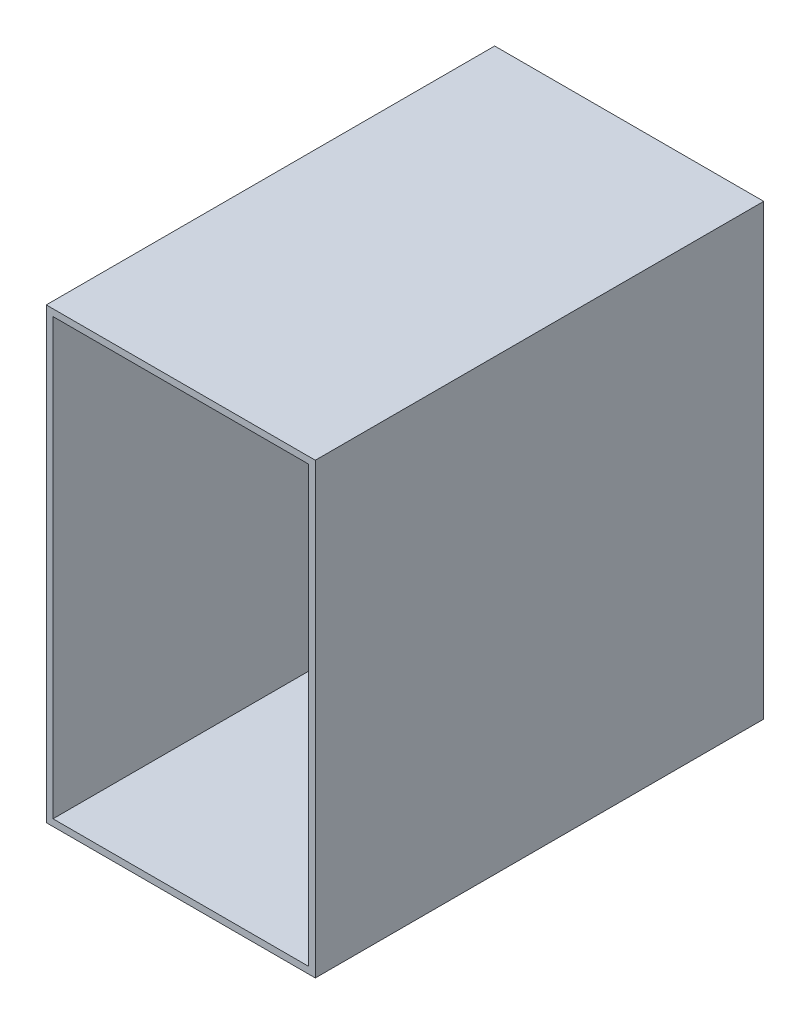
ISO-10303-21;
HEADER;
FILE_DESCRIPTION(('STEP AP214'),'2;1');
FILE_NAME('part.step','',(''),(''),'','','');
FILE_SCHEMA(('AUTOMOTIVE_DESIGN { 1 0 10303 214 1 1 1 1 }'));
ENDSEC;
DATA;
#1=APPLICATION_CONTEXT('core data for automotive mechanical design processes');
#2=APPLICATION_PROTOCOL_DEFINITION('international standard','automotive_design',2000,#1);
#3=PRODUCT_CONTEXT('',#1,'mechanical');
#4=PRODUCT('Part','Part','',(#3));
#5=PRODUCT_RELATED_PRODUCT_CATEGORY('part','',(#4));
#6=PRODUCT_DEFINITION_FORMATION('','',#4);
#7=PRODUCT_DEFINITION_CONTEXT('part definition',#1,'design');
#8=PRODUCT_DEFINITION('design','',#6,#7);
#9=PRODUCT_DEFINITION_SHAPE('','',#8);
#10=(LENGTH_UNIT() NAMED_UNIT(*) SI_UNIT(.MILLI.,.METRE.));
#11=(NAMED_UNIT(*) PLANE_ANGLE_UNIT() SI_UNIT($,.RADIAN.));
#12=(NAMED_UNIT(*) SI_UNIT($,.STERADIAN.) SOLID_ANGLE_UNIT());
#13=UNCERTAINTY_MEASURE_WITH_UNIT(LENGTH_MEASURE(1.E-05),#10,'distance_accuracy_value','');
#14=(GEOMETRIC_REPRESENTATION_CONTEXT(3) GLOBAL_UNCERTAINTY_ASSIGNED_CONTEXT((#13)) GLOBAL_UNIT_ASSIGNED_CONTEXT((#10,
#11,#12)) REPRESENTATION_CONTEXT('',''));
#15=CARTESIAN_POINT('',(0.,0.,0.));
#16=DIRECTION('',(0.,0.,1.));
#17=DIRECTION('',(1.,0.,0.));
#18=AXIS2_PLACEMENT_3D('',#15,#16,#17);
#19=CARTESIAN_POINT('',(0.,0.,200.));
#20=DIRECTION('',(0.,0.,-1.));
#21=DIRECTION('',(-1.,0.,0.));
#22=AXIS2_PLACEMENT_3D('',#19,#20,#21);
#23=PLANE('',#22);
#24=DIRECTION('',(0.,-1.,0.));
#25=VECTOR('',#24,1.);
#26=CARTESIAN_POINT('',(0.,0.,200.));
#27=LINE('',#26,#25);
#28=CARTESIAN_POINT('',(0.,200.,200.));
#29=VERTEX_POINT('',#28);
#30=CARTESIAN_POINT('',(0.,0.,200.));
#31=VERTEX_POINT('',#30);
#32=EDGE_CURVE('E149',#29,#31,#27,.T.);
#33=ORIENTED_EDGE('',*,*,#32,.T.);
#34=DIRECTION('',(1.,0.,0.));
#35=VECTOR('',#34,1.);
#36=CARTESIAN_POINT('',(0.,0.,200.));
#37=LINE('',#36,#35);
#38=CARTESIAN_POINT('',(120.,0.,200.));
#39=VERTEX_POINT('',#38);
#40=EDGE_CURVE('E93',#31,#39,#37,.T.);
#41=ORIENTED_EDGE('',*,*,#40,.T.);
#42=DIRECTION('',(0.,1.,0.));
#43=VECTOR('',#42,1.);
#44=CARTESIAN_POINT('',(120.,0.,200.));
#45=LINE('',#44,#43);
#46=CARTESIAN_POINT('',(120.,200.,200.));
#47=VERTEX_POINT('',#46);
#48=EDGE_CURVE('E152',#39,#47,#45,.T.);
#49=ORIENTED_EDGE('',*,*,#48,.T.);
#50=DIRECTION('',(-1.,0.,0.));
#51=VECTOR('',#50,1.);
#52=CARTESIAN_POINT('',(0.,200.,200.));
#53=LINE('',#52,#51);
#54=EDGE_CURVE('E65',#47,#29,#53,.T.);
#55=ORIENTED_EDGE('',*,*,#54,.T.);
#56=EDGE_LOOP('',(#33,#41,#49,#55));
#57=FACE_BOUND('',#56,.T.);
#58=DIRECTION('',(0.,-1.,0.));
#59=VECTOR('',#58,1.);
#60=CARTESIAN_POINT('',(3.,0.,200.));
#61=LINE('',#60,#59);
#62=CARTESIAN_POINT('',(3.,197.,200.));
#63=VERTEX_POINT('',#62);
#64=CARTESIAN_POINT('',(3.,3.,200.));
#65=VERTEX_POINT('',#64);
#66=EDGE_CURVE('E138',#63,#65,#61,.T.);
#67=ORIENTED_EDGE('',*,*,#66,.F.);
#68=DIRECTION('',(-1.,0.,0.));
#69=VECTOR('',#68,1.);
#70=CARTESIAN_POINT('',(0.,197.,200.));
#71=LINE('',#70,#69);
#72=CARTESIAN_POINT('',(117.,197.,200.));
#73=VERTEX_POINT('',#72);
#74=EDGE_CURVE('E147',#73,#63,#71,.T.);
#75=ORIENTED_EDGE('',*,*,#74,.F.);
#76=DIRECTION('',(0.,1.,0.));
#77=VECTOR('',#76,1.);
#78=CARTESIAN_POINT('',(117.,0.,200.));
#79=LINE('',#78,#77);
#80=CARTESIAN_POINT('',(117.,3.,200.));
#81=VERTEX_POINT('',#80);
#82=EDGE_CURVE('E145',#81,#73,#79,.T.);
#83=ORIENTED_EDGE('',*,*,#82,.F.);
#84=DIRECTION('',(1.,0.,0.));
#85=VECTOR('',#84,1.);
#86=CARTESIAN_POINT('',(0.,3.,200.));
#87=LINE('',#86,#85);
#88=EDGE_CURVE('E130',#65,#81,#87,.T.);
#89=ORIENTED_EDGE('',*,*,#88,.F.);
#90=EDGE_LOOP('',(#67,#75,#83,#89));
#91=FACE_BOUND('',#90,.T.);
#92=ADVANCED_FACE('F41',(#57,#91),#23,.F.);
#93=CARTESIAN_POINT('',(0.,0.,200.));
#94=DIRECTION('',(1.,0.,0.));
#95=DIRECTION('',(0.,0.,-1.));
#96=AXIS2_PLACEMENT_3D('',#93,#94,#95);
#97=PLANE('',#96);
#98=DIRECTION('',(0.,-1.,0.));
#99=VECTOR('',#98,1.);
#100=CARTESIAN_POINT('',(0.,0.,0.));
#101=LINE('',#100,#99);
#102=CARTESIAN_POINT('',(0.,200.,0.));
#103=VERTEX_POINT('',#102);
#104=CARTESIAN_POINT('',(0.,0.,0.));
#105=VERTEX_POINT('',#104);
#106=EDGE_CURVE('E156',#103,#105,#101,.T.);
#107=ORIENTED_EDGE('',*,*,#106,.T.);
#108=DIRECTION('',(0.,0.,-1.));
#109=VECTOR('',#108,1.);
#110=CARTESIAN_POINT('',(0.,0.,200.));
#111=LINE('',#110,#109);
#112=EDGE_CURVE('E11',#31,#105,#111,.T.);
#113=ORIENTED_EDGE('',*,*,#112,.F.);
#114=ORIENTED_EDGE('',*,*,#32,.F.);
#115=DIRECTION('',(0.,0.,-1.));
#116=VECTOR('',#115,1.);
#117=CARTESIAN_POINT('',(0.,200.,200.));
#118=LINE('',#117,#116);
#119=EDGE_CURVE('E155',#29,#103,#118,.T.);
#120=ORIENTED_EDGE('',*,*,#119,.T.);
#121=EDGE_LOOP('',(#107,#113,#114,#120));
#122=FACE_BOUND('',#121,.T.);
#123=ADVANCED_FACE('F43',(#122),#97,.F.);
#124=CARTESIAN_POINT('',(0.,0.,200.));
#125=DIRECTION('',(0.,1.,0.));
#126=DIRECTION('',(0.,0.,1.));
#127=AXIS2_PLACEMENT_3D('',#124,#125,#126);
#128=PLANE('',#127);
#129=DIRECTION('',(1.,0.,0.));
#130=VECTOR('',#129,1.);
#131=CARTESIAN_POINT('',(0.,0.,0.));
#132=LINE('',#131,#130);
#133=CARTESIAN_POINT('',(120.,0.,0.));
#134=VERTEX_POINT('',#133);
#135=EDGE_CURVE('E159',#105,#134,#132,.T.);
#136=ORIENTED_EDGE('',*,*,#135,.T.);
#137=DIRECTION('',(0.,0.,-1.));
#138=VECTOR('',#137,1.);
#139=CARTESIAN_POINT('',(120.,0.,200.));
#140=LINE('',#139,#138);
#141=EDGE_CURVE('E49',#39,#134,#140,.T.);
#142=ORIENTED_EDGE('',*,*,#141,.F.);
#143=ORIENTED_EDGE('',*,*,#40,.F.);
#144=ORIENTED_EDGE('',*,*,#112,.T.);
#145=EDGE_LOOP('',(#136,#142,#143,#144));
#146=FACE_BOUND('',#145,.T.);
#147=ADVANCED_FACE('F187',(#146),#128,.F.);
#148=CARTESIAN_POINT('',(120.,0.,200.));
#149=DIRECTION('',(-1.,0.,0.));
#150=DIRECTION('',(0.,0.,1.));
#151=AXIS2_PLACEMENT_3D('',#148,#149,#150);
#152=PLANE('',#151);
#153=DIRECTION('',(0.,1.,0.));
#154=VECTOR('',#153,1.);
#155=CARTESIAN_POINT('',(120.,0.,0.));
#156=LINE('',#155,#154);
#157=CARTESIAN_POINT('',(120.,200.,0.));
#158=VERTEX_POINT('',#157);
#159=EDGE_CURVE('E161',#134,#158,#156,.T.);
#160=ORIENTED_EDGE('',*,*,#159,.T.);
#161=DIRECTION('',(0.,0.,-1.));
#162=VECTOR('',#161,1.);
#163=CARTESIAN_POINT('',(120.,200.,200.));
#164=LINE('',#163,#162);
#165=EDGE_CURVE('E165',#47,#158,#164,.T.);
#166=ORIENTED_EDGE('',*,*,#165,.F.);
#167=ORIENTED_EDGE('',*,*,#48,.F.);
#168=ORIENTED_EDGE('',*,*,#141,.T.);
#169=EDGE_LOOP('',(#160,#166,#167,#168));
#170=FACE_BOUND('',#169,.T.);
#171=ADVANCED_FACE('F170',(#170),#152,.F.);
#172=CARTESIAN_POINT('',(0.,200.,200.));
#173=DIRECTION('',(0.,-1.,0.));
#174=DIRECTION('',(0.,0.,-1.));
#175=AXIS2_PLACEMENT_3D('',#172,#173,#174);
#176=PLANE('',#175);
#177=DIRECTION('',(-1.,0.,0.));
#178=VECTOR('',#177,1.);
#179=CARTESIAN_POINT('',(0.,200.,0.));
#180=LINE('',#179,#178);
#181=EDGE_CURVE('E86',#158,#103,#180,.T.);
#182=ORIENTED_EDGE('',*,*,#181,.T.);
#183=ORIENTED_EDGE('',*,*,#119,.F.);
#184=ORIENTED_EDGE('',*,*,#54,.F.);
#185=ORIENTED_EDGE('',*,*,#165,.T.);
#186=EDGE_LOOP('',(#182,#183,#184,#185));
#187=FACE_BOUND('',#186,.T.);
#188=ADVANCED_FACE('F178',(#187),#176,.F.);
#189=CARTESIAN_POINT('',(0.,0.,0.));
#190=DIRECTION('',(0.,0.,-1.));
#191=DIRECTION('',(-1.,0.,0.));
#192=AXIS2_PLACEMENT_3D('',#189,#190,#191);
#193=PLANE('',#192);
#194=ORIENTED_EDGE('',*,*,#106,.F.);
#195=ORIENTED_EDGE('',*,*,#181,.F.);
#196=ORIENTED_EDGE('',*,*,#159,.F.);
#197=ORIENTED_EDGE('',*,*,#135,.F.);
#198=EDGE_LOOP('',(#194,#195,#196,#197));
#199=FACE_BOUND('',#198,.T.);
#200=ADVANCED_FACE('F174',(#199),#193,.T.);
#201=CARTESIAN_POINT('',(3.,0.,200.));
#202=DIRECTION('',(1.,0.,0.));
#203=DIRECTION('',(0.,0.,-1.));
#204=AXIS2_PLACEMENT_3D('',#201,#202,#203);
#205=PLANE('',#204);
#206=DIRECTION('',(0.,-1.,0.));
#207=VECTOR('',#206,1.);
#208=CARTESIAN_POINT('',(3.,0.,3.));
#209=LINE('',#208,#207);
#210=CARTESIAN_POINT('',(3.,197.,3.));
#211=VERTEX_POINT('',#210);
#212=CARTESIAN_POINT('',(3.,3.,3.));
#213=VERTEX_POINT('',#212);
#214=EDGE_CURVE('E121',#211,#213,#209,.T.);
#215=ORIENTED_EDGE('',*,*,#214,.F.);
#216=DIRECTION('',(0.,0.,-1.));
#217=VECTOR('',#216,1.);
#218=CARTESIAN_POINT('',(3.,197.,200.));
#219=LINE('',#218,#217);
#220=EDGE_CURVE('E141',#63,#211,#219,.T.);
#221=ORIENTED_EDGE('',*,*,#220,.F.);
#222=ORIENTED_EDGE('',*,*,#66,.T.);
#223=DIRECTION('',(0.,0.,-1.));
#224=VECTOR('',#223,1.);
#225=CARTESIAN_POINT('',(3.,3.,200.));
#226=LINE('',#225,#224);
#227=EDGE_CURVE('E133',#65,#213,#226,.T.);
#228=ORIENTED_EDGE('',*,*,#227,.T.);
#229=EDGE_LOOP('',(#215,#221,#222,#228));
#230=FACE_BOUND('',#229,.T.);
#231=ADVANCED_FACE('F185',(#230),#205,.T.);
#232=CARTESIAN_POINT('',(0.,3.,200.));
#233=DIRECTION('',(0.,1.,0.));
#234=DIRECTION('',(0.,0.,1.));
#235=AXIS2_PLACEMENT_3D('',#232,#233,#234);
#236=PLANE('',#235);
#237=DIRECTION('',(1.,0.,0.));
#238=VECTOR('',#237,1.);
#239=CARTESIAN_POINT('',(0.,3.,3.));
#240=LINE('',#239,#238);
#241=CARTESIAN_POINT('',(117.,3.,3.));
#242=VERTEX_POINT('',#241);
#243=EDGE_CURVE('E115',#213,#242,#240,.T.);
#244=ORIENTED_EDGE('',*,*,#243,.F.);
#245=ORIENTED_EDGE('',*,*,#227,.F.);
#246=ORIENTED_EDGE('',*,*,#88,.T.);
#247=DIRECTION('',(0.,0.,-1.));
#248=VECTOR('',#247,1.);
#249=CARTESIAN_POINT('',(117.,3.,200.));
#250=LINE('',#249,#248);
#251=EDGE_CURVE('E127',#81,#242,#250,.T.);
#252=ORIENTED_EDGE('',*,*,#251,.T.);
#253=EDGE_LOOP('',(#244,#245,#246,#252));
#254=FACE_BOUND('',#253,.T.);
#255=ADVANCED_FACE('F128',(#254),#236,.T.);
#256=CARTESIAN_POINT('',(117.,0.,200.));
#257=DIRECTION('',(-1.,0.,0.));
#258=DIRECTION('',(0.,0.,1.));
#259=AXIS2_PLACEMENT_3D('',#256,#257,#258);
#260=PLANE('',#259);
#261=CARTESIAN_POINT('',(117.,100.,100.));
#262=DIRECTION('',(-1.,0.,0.));
#263=DIRECTION('',(0.,0.,1.));
#264=AXIS2_PLACEMENT_3D('',#261,#262,#263);
#265=CIRCLE('',#264,9.99999999999999);
#266=CARTESIAN_POINT('',(117.,100.,110.));
#267=VERTEX_POINT('',#266);
#268=EDGE_CURVE('E221',#267,#267,#265,.T.);
#269=ORIENTED_EDGE('',*,*,#268,.F.);
#270=EDGE_LOOP('',(#269));
#271=FACE_BOUND('',#270,.T.);
#272=DIRECTION('',(0.,1.,0.));
#273=VECTOR('',#272,1.);
#274=CARTESIAN_POINT('',(117.,0.,3.));
#275=LINE('',#274,#273);
#276=CARTESIAN_POINT('',(117.,197.,3.));
#277=VERTEX_POINT('',#276);
#278=EDGE_CURVE('E119',#242,#277,#275,.T.);
#279=ORIENTED_EDGE('',*,*,#278,.F.);
#280=ORIENTED_EDGE('',*,*,#251,.F.);
#281=ORIENTED_EDGE('',*,*,#82,.T.);
#282=DIRECTION('',(0.,0.,-1.));
#283=VECTOR('',#282,1.);
#284=CARTESIAN_POINT('',(117.,197.,200.));
#285=LINE('',#284,#283);
#286=EDGE_CURVE('E56',#73,#277,#285,.T.);
#287=ORIENTED_EDGE('',*,*,#286,.T.);
#288=EDGE_LOOP('',(#279,#280,#281,#287));
#289=FACE_BOUND('',#288,.T.);
#290=ADVANCED_FACE('F135',(#271,#289),#260,.T.);
#291=CARTESIAN_POINT('',(0.,197.,200.));
#292=DIRECTION('',(0.,-1.,0.));
#293=DIRECTION('',(0.,0.,-1.));
#294=AXIS2_PLACEMENT_3D('',#291,#292,#293);
#295=PLANE('',#294);
#296=DIRECTION('',(-1.,0.,0.));
#297=VECTOR('',#296,1.);
#298=CARTESIAN_POINT('',(0.,197.,3.));
#299=LINE('',#298,#297);
#300=EDGE_CURVE('E136',#277,#211,#299,.T.);
#301=ORIENTED_EDGE('',*,*,#300,.F.);
#302=ORIENTED_EDGE('',*,*,#286,.F.);
#303=ORIENTED_EDGE('',*,*,#74,.T.);
#304=ORIENTED_EDGE('',*,*,#220,.T.);
#305=EDGE_LOOP('',(#301,#302,#303,#304));
#306=FACE_BOUND('',#305,.T.);
#307=ADVANCED_FACE('F199',(#306),#295,.T.);
#308=CARTESIAN_POINT('',(0.,0.,3.));
#309=DIRECTION('',(0.,0.,-1.));
#310=DIRECTION('',(-1.,0.,0.));
#311=AXIS2_PLACEMENT_3D('',#308,#309,#310);
#312=PLANE('',#311);
#313=ORIENTED_EDGE('',*,*,#214,.T.);
#314=ORIENTED_EDGE('',*,*,#243,.T.);
#315=ORIENTED_EDGE('',*,*,#278,.T.);
#316=ORIENTED_EDGE('',*,*,#300,.T.);
#317=EDGE_LOOP('',(#313,#314,#315,#316));
#318=FACE_BOUND('',#317,.T.);
#319=ADVANCED_FACE('F117',(#318),#312,.F.);
#320=CARTESIAN_POINT('',(37.,100.,100.));
#321=DIRECTION('',(1.,0.,0.));
#322=DIRECTION('',(0.,0.,-1.));
#323=AXIS2_PLACEMENT_3D('',#320,#321,#322);
#324=CYLINDRICAL_SURFACE('',#323,9.99999999999999);
#325=CARTESIAN_POINT('',(37.,100.,100.));
#326=DIRECTION('',(-1.,0.,0.));
#327=DIRECTION('',(0.,0.,1.));
#328=AXIS2_PLACEMENT_3D('',#325,#326,#327);
#329=CIRCLE('',#328,9.99999999999999);
#330=CARTESIAN_POINT('',(37.,100.,110.));
#331=VERTEX_POINT('',#330);
#332=EDGE_CURVE('E220',#331,#331,#329,.T.);
#333=ORIENTED_EDGE('',*,*,#332,.F.);
#334=EDGE_LOOP('',(#333));
#335=FACE_BOUND('',#334,.T.);
#336=ORIENTED_EDGE('',*,*,#268,.T.);
#337=EDGE_LOOP('',(#336));
#338=FACE_BOUND('',#337,.T.);
#339=ADVANCED_FACE('F198',(#335,#338),#324,.T.);
#340=CARTESIAN_POINT('',(37.,100.,100.));
#341=DIRECTION('',(-1.,0.,0.));
#342=DIRECTION('',(0.,0.,1.));
#343=AXIS2_PLACEMENT_3D('',#340,#341,#342);
#344=PLANE('',#343);
#345=ORIENTED_EDGE('',*,*,#332,.T.);
#346=EDGE_LOOP('',(#345));
#347=FACE_BOUND('',#346,.T.);
#348=ADVANCED_FACE('F212',(#347),#344,.T.);
#349=CLOSED_SHELL('',(#92,#123,#147,#171,#188,#200,#231,#255,#290,#307,#319,#339,#348));
#350=MANIFOLD_SOLID_BREP('B2',#349);
#351=ADVANCED_BREP_SHAPE_REPRESENTATION('',(#18,#350),#14);
#352=SHAPE_DEFINITION_REPRESENTATION(#9,#351);
ENDSEC;
END-ISO-10303-21;
